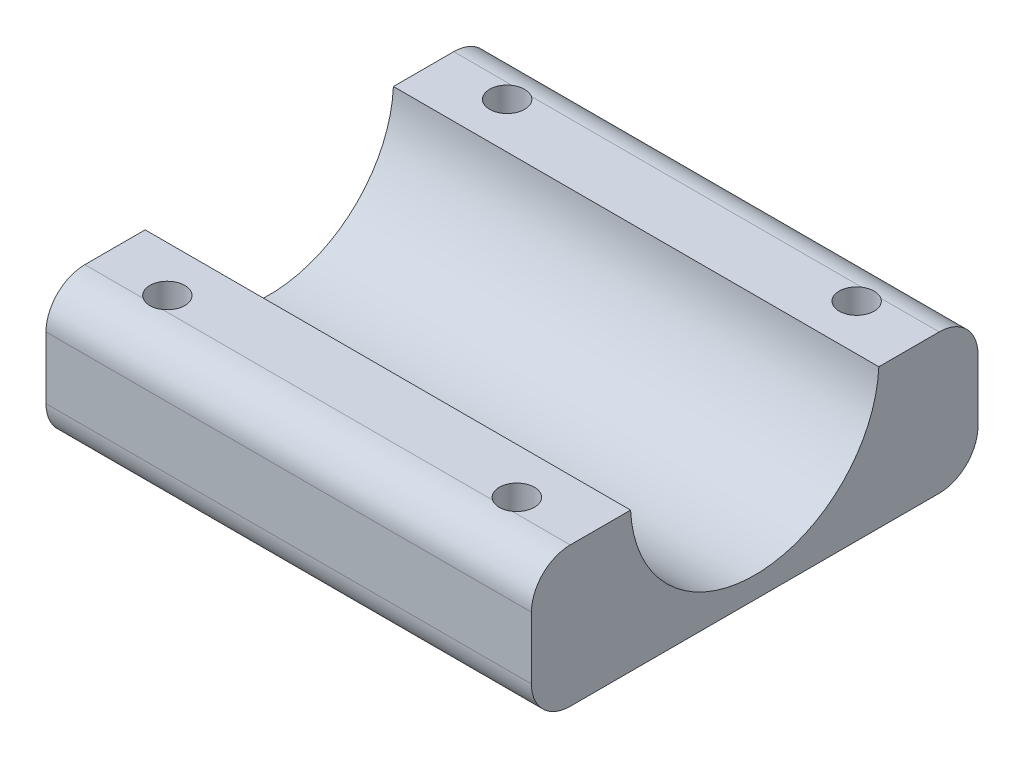
ISO-10303-21;
HEADER;
FILE_DESCRIPTION(('STEP AP214'),'2;1');
FILE_NAME('part.step','',(''),(''),'','','');
FILE_SCHEMA(('AUTOMOTIVE_DESIGN { 1 0 10303 214 1 1 1 1 }'));
ENDSEC;
DATA;
#1=APPLICATION_CONTEXT('core data for automotive mechanical design processes');
#2=APPLICATION_PROTOCOL_DEFINITION('international standard','automotive_design',2000,#1);
#3=PRODUCT_CONTEXT('',#1,'mechanical');
#4=PRODUCT('Part','Part','',(#3));
#5=PRODUCT_RELATED_PRODUCT_CATEGORY('part','',(#4));
#6=PRODUCT_DEFINITION_FORMATION('','',#4);
#7=PRODUCT_DEFINITION_CONTEXT('part definition',#1,'design');
#8=PRODUCT_DEFINITION('design','',#6,#7);
#9=PRODUCT_DEFINITION_SHAPE('','',#8);
#10=(LENGTH_UNIT() NAMED_UNIT(*) SI_UNIT(.MILLI.,.METRE.));
#11=(NAMED_UNIT(*) PLANE_ANGLE_UNIT() SI_UNIT($,.RADIAN.));
#12=(NAMED_UNIT(*) SI_UNIT($,.STERADIAN.) SOLID_ANGLE_UNIT());
#13=UNCERTAINTY_MEASURE_WITH_UNIT(LENGTH_MEASURE(1.E-05),#10,'distance_accuracy_value','');
#14=(GEOMETRIC_REPRESENTATION_CONTEXT(3) GLOBAL_UNCERTAINTY_ASSIGNED_CONTEXT((#13)) GLOBAL_UNIT_ASSIGNED_CONTEXT((#10,
#11,#12)) REPRESENTATION_CONTEXT('',''));
#15=CARTESIAN_POINT('',(0.,0.,0.));
#16=DIRECTION('',(0.,0.,1.));
#17=DIRECTION('',(1.,0.,0.));
#18=AXIS2_PLACEMENT_3D('',#15,#16,#17);
#19=CARTESIAN_POINT('',(25.,-11.,19.));
#20=DIRECTION('',(-1.,0.,0.));
#21=DIRECTION('',(0.,0.,1.));
#22=AXIS2_PLACEMENT_3D('',#19,#20,#21);
#23=CYLINDRICAL_SURFACE('',#22,4.);
#24=CARTESIAN_POINT('',(-15.1168593513323,-15.,19.));
#25=CARTESIAN_POINT('',(-15.1573493226515,-15.0000109242073,19.0778574955817));
#26=CARTESIAN_POINT('',(-15.200999771013,-14.9977274477931,19.1540259495156));
#27=CARTESIAN_POINT('',(-15.2941534411244,-14.9892434582838,19.3023684001236));
#28=CARTESIAN_POINT('',(-15.3436508801665,-14.9830467894245,19.3745462414952));
#29=CARTESIAN_POINT('',(-15.4478605502063,-14.9674431467714,19.5141099444437));
#30=CARTESIAN_POINT('',(-15.5025465894272,-14.9580517369091,19.5815171592083));
#31=CARTESIAN_POINT('',(-15.6169036932135,-14.9367588944703,19.7115277345354));
#32=CARTESIAN_POINT('',(-15.6765759342423,-14.924856868514,19.7741299546666));
#33=CARTESIAN_POINT('',(-15.862041479088,-14.8865410499203,19.9538040445996));
#34=CARTESIAN_POINT('',(-15.9947269476371,-14.8574402181653,20.063333735106));
#35=CARTESIAN_POINT('',(-16.2755732584803,-14.7977204142456,20.2601369098951));
#36=CARTESIAN_POINT('',(-16.423759698811,-14.7670989762058,20.3473727339024));
#37=CARTESIAN_POINT('',(-16.7445051105219,-14.7077377901675,20.5033912591476));
#38=CARTESIAN_POINT('',(-16.9180602444234,-14.6793171325302,20.5702714707651));
#39=CARTESIAN_POINT('',(-17.2752769746375,-14.6334988458983,20.67360310912));
#40=CARTESIAN_POINT('',(-17.458925459799,-14.6160872676328,20.7100930611152));
#41=CARTESIAN_POINT('',(-17.8198788257026,-14.5970438866187,20.7497826168194));
#42=CARTESIAN_POINT('',(-17.9969393040315,-14.5945604785481,20.7547796461988));
#43=CARTESIAN_POINT('',(-18.3491448521233,-14.603665315988,20.7360004114565));
#44=CARTESIAN_POINT('',(-18.5242899279135,-14.6152535172044,20.7122242379062));
#45=CARTESIAN_POINT('',(-18.8567868208954,-14.6488250161309,20.6393688950356));
#46=CARTESIAN_POINT('',(-19.0145726857033,-14.6701323340066,20.5919187162139));
#47=CARTESIAN_POINT('',(-19.3204469731311,-14.7189794615007,20.474190682313));
#48=CARTESIAN_POINT('',(-19.4685267128945,-14.7465247559277,20.4038927142524));
#49=CARTESIAN_POINT('',(-19.7650444420969,-14.8058026088642,20.2347450945025));
#50=CARTESIAN_POINT('',(-19.9123106589385,-14.8376887696085,20.13389244722));
#51=CARTESIAN_POINT('',(-20.1887309133918,-14.8970581196079,19.9090688065648));
#52=CARTESIAN_POINT('',(-20.3179137736349,-14.924548325662,19.7851353533026));
#53=CARTESIAN_POINT('',(-20.5232310806332,-14.9629034475965,19.5525613074241));
#54=CARTESIAN_POINT('',(-20.604313957578,-14.9762483146135,19.4486923027872));
#55=CARTESIAN_POINT('',(-20.7163084023614,-14.9901621549613,19.2856467872631));
#56=CARTESIAN_POINT('',(-20.7520715842306,-14.9937835167149,19.2300209908782));
#57=CARTESIAN_POINT('',(-20.8202018509445,-14.9987044935031,19.1165845685183));
#58=CARTESIAN_POINT('',(-20.8525668818273,-15.0000027118666,19.058772649559));
#59=CARTESIAN_POINT('',(-20.8831406486677,-15.,19.));
#60=B_SPLINE_CURVE_WITH_KNOTS('',3,(#24,#25,#26,#27,#28,#29,#30,#31,#32,#33,#34,#35,#36,#37,#38,
#39,#40,#41,#42,#43,#44,#45,#46,#47,#48,#49,#50,#51,#52,#53,#54,#55,#56,#57,#58,#59),
.UNSPECIFIED.,.F.,.F.,(4,2,2,2,2,2,2,2,2,2,2,2,2,2,2,2,2,4),(0.,0.263108350436759,
0.525958630143495,0.787546288254287,1.0491958415726,1.5702947033418,2.09226810629026,
2.65384856233941,3.21471602330402,3.74325888086913,4.27180007470835,4.76815579490835,
5.26494964749648,5.80654118475775,6.34725941618147,6.7433968577492,6.94193709517688,
7.140596654703),.UNSPECIFIED.);
#61=CARTESIAN_POINT('',(-15.1168593513323,-15.,19.));
#62=VERTEX_POINT('',#61);
#63=CARTESIAN_POINT('',(-20.8831406486677,-15.,19.));
#64=VERTEX_POINT('',#63);
#65=EDGE_CURVE('E62',#62,#64,#60,.T.);
#66=ORIENTED_EDGE('',*,*,#65,.F.);
#67=DIRECTION('',(-1.,0.,0.));
#68=VECTOR('',#67,1.);
#69=CARTESIAN_POINT('',(25.,-15.,19.));
#70=LINE('',#69,#68);
#71=CARTESIAN_POINT('',(15.1168593513323,-15.,19.));
#72=VERTEX_POINT('',#71);
#73=EDGE_CURVE('E197',#72,#62,#70,.T.);
#74=ORIENTED_EDGE('',*,*,#73,.F.);
#75=CARTESIAN_POINT('',(20.8831406486677,-15.,19.));
#76=CARTESIAN_POINT('',(20.8426506773485,-15.0000109242073,19.0778574955817));
#77=CARTESIAN_POINT('',(20.799000228987,-14.9977274477931,19.1540259495156));
#78=CARTESIAN_POINT('',(20.7058465588756,-14.9892434582838,19.3023684001236));
#79=CARTESIAN_POINT('',(20.6563491198335,-14.9830467894245,19.3745462414952));
#80=CARTESIAN_POINT('',(20.5521394497937,-14.9674431467714,19.5141099444437));
#81=CARTESIAN_POINT('',(20.4974534105728,-14.9580517369091,19.5815171592083));
#82=CARTESIAN_POINT('',(20.3830963067864,-14.9367588944703,19.7115277345354));
#83=CARTESIAN_POINT('',(20.3234240657577,-14.924856868514,19.7741299546666));
#84=CARTESIAN_POINT('',(20.137958520912,-14.8865410499203,19.9538040445996));
#85=CARTESIAN_POINT('',(20.0052730523629,-14.8574402181653,20.063333735106));
#86=CARTESIAN_POINT('',(19.7244267415197,-14.7977204142456,20.2601369098951));
#87=CARTESIAN_POINT('',(19.576240301189,-14.7670989762058,20.3473727339024));
#88=CARTESIAN_POINT('',(19.2554948894781,-14.7077377901675,20.5033912591476));
#89=CARTESIAN_POINT('',(19.0819397555766,-14.6793171325302,20.5702714707651));
#90=CARTESIAN_POINT('',(18.7247230253625,-14.6334988458983,20.67360310912));
#91=CARTESIAN_POINT('',(18.541074540201,-14.6160872676328,20.7100930611152));
#92=CARTESIAN_POINT('',(18.1801211742974,-14.5970438866187,20.7497826168194));
#93=CARTESIAN_POINT('',(18.0030606959685,-14.5945604785481,20.7547796461988));
#94=CARTESIAN_POINT('',(17.6508551478767,-14.603665315988,20.7360004114565));
#95=CARTESIAN_POINT('',(17.4757100720865,-14.6152535172044,20.7122242379062));
#96=CARTESIAN_POINT('',(17.1432131791046,-14.6488250161309,20.6393688950356));
#97=CARTESIAN_POINT('',(16.9854273142967,-14.6701323340066,20.5919187162139));
#98=CARTESIAN_POINT('',(16.6795530268689,-14.7189794615007,20.474190682313));
#99=CARTESIAN_POINT('',(16.5314732871055,-14.7465247559277,20.4038927142524));
#100=CARTESIAN_POINT('',(16.2349555579031,-14.8058026088642,20.2347450945025));
#101=CARTESIAN_POINT('',(16.0876893410615,-14.8376887696085,20.13389244722));
#102=CARTESIAN_POINT('',(15.8112690866082,-14.8970581196079,19.9090688065648));
#103=CARTESIAN_POINT('',(15.6820862263651,-14.924548325662,19.7851353533026));
#104=CARTESIAN_POINT('',(15.4767689193668,-14.9629034475965,19.5525613074241));
#105=CARTESIAN_POINT('',(15.395686042422,-14.9762483146135,19.4486923027872));
#106=CARTESIAN_POINT('',(15.2836915976386,-14.9901621549613,19.2856467872631));
#107=CARTESIAN_POINT('',(15.2479284157694,-14.9937835167149,19.2300209908782));
#108=CARTESIAN_POINT('',(15.1797981490555,-14.9987044935031,19.1165845685183));
#109=CARTESIAN_POINT('',(15.1474331181727,-15.0000027118666,19.058772649559));
#110=CARTESIAN_POINT('',(15.1168593513323,-15.,19.));
#111=B_SPLINE_CURVE_WITH_KNOTS('',3,(#75,#76,#77,#78,#79,#80,#81,#82,#83,#84,#85,#86,#87,#88,
#89,#90,#91,#92,#93,#94,#95,#96,#97,#98,#99,#100,#101,#102,#103,#104,#105,#106,#107,#108,#109,
#110),.UNSPECIFIED.,.F.,.F.,(4,2,2,2,2,2,2,2,2,2,2,2,2,2,2,2,2,4),(0.,0.263108350436761,
0.525958630143493,0.787546288254281,1.04919584157259,1.5702947033418,2.09226810629026,
2.6538485623394,3.21471602330401,3.74325888086913,4.27180007470835,4.76815579490835,
5.26494964749648,5.80654118475775,6.34725941618147,6.7433968577492,6.94193709517688,
7.140596654703),.UNSPECIFIED.);
#112=CARTESIAN_POINT('',(20.8831406486677,-15.,19.));
#113=VERTEX_POINT('',#112);
#114=EDGE_CURVE('E411',#113,#72,#111,.T.);
#115=ORIENTED_EDGE('',*,*,#114,.F.);
#116=CARTESIAN_POINT('',(25.,-15.,19.));
#117=VERTEX_POINT('',#116);
#118=EDGE_CURVE('E193',#117,#113,#70,.T.);
#119=ORIENTED_EDGE('',*,*,#118,.F.);
#120=CARTESIAN_POINT('',(25.,-11.,19.));
#121=DIRECTION('',(1.,0.,0.));
#122=DIRECTION('',(0.,0.,-1.));
#123=AXIS2_PLACEMENT_3D('',#120,#121,#122);
#124=CIRCLE('',#123,4.);
#125=CARTESIAN_POINT('',(25.,-11.,23.));
#126=VERTEX_POINT('',#125);
#127=EDGE_CURVE('E299',#126,#117,#124,.T.);
#128=ORIENTED_EDGE('',*,*,#127,.F.);
#129=DIRECTION('',(-1.,0.,0.));
#130=VECTOR('',#129,1.);
#131=CARTESIAN_POINT('',(25.,-11.,23.));
#132=LINE('',#131,#130);
#133=CARTESIAN_POINT('',(-25.,-11.,23.));
#134=VERTEX_POINT('',#133);
#135=EDGE_CURVE('E275',#126,#134,#132,.T.);
#136=ORIENTED_EDGE('',*,*,#135,.T.);
#137=CARTESIAN_POINT('',(-25.,-11.,19.));
#138=DIRECTION('',(1.,0.,0.));
#139=DIRECTION('',(0.,0.,-1.));
#140=AXIS2_PLACEMENT_3D('',#137,#138,#139);
#141=CIRCLE('',#140,4.);
#142=CARTESIAN_POINT('',(-25.,-15.,19.));
#143=VERTEX_POINT('',#142);
#144=EDGE_CURVE('E268',#134,#143,#141,.T.);
#145=ORIENTED_EDGE('',*,*,#144,.T.);
#146=EDGE_CURVE('E188',#64,#143,#70,.T.);
#147=ORIENTED_EDGE('',*,*,#146,.F.);
#148=EDGE_LOOP('',(#66,#74,#115,#119,#128,#136,#145,#147));
#149=FACE_BOUND('',#148,.T.);
#150=ADVANCED_FACE('F39',(#149),#23,.T.);
#151=CARTESIAN_POINT('',(25.,-11.,-19.));
#152=DIRECTION('',(-1.,0.,0.));
#153=DIRECTION('',(0.,0.,1.));
#154=AXIS2_PLACEMENT_3D('',#151,#152,#153);
#155=CYLINDRICAL_SURFACE('',#154,4.);
#156=CARTESIAN_POINT('',(15.1168593513323,-15.,-19.));
#157=CARTESIAN_POINT('',(15.1573493226515,-15.0000109242073,-19.0778574955817));
#158=CARTESIAN_POINT('',(15.200999771013,-14.9977274477931,-19.1540259495156));
#159=CARTESIAN_POINT('',(15.2941534411244,-14.9892434582838,-19.3023684001236));
#160=CARTESIAN_POINT('',(15.3436508801665,-14.9830467894245,-19.3745462414952));
#161=CARTESIAN_POINT('',(15.4478605502063,-14.9674431467714,-19.5141099444437));
#162=CARTESIAN_POINT('',(15.5025465894272,-14.9580517369091,-19.5815171592083));
#163=CARTESIAN_POINT('',(15.6169036932135,-14.9367588944703,-19.7115277345354));
#164=CARTESIAN_POINT('',(15.6765759342423,-14.924856868514,-19.7741299546666));
#165=CARTESIAN_POINT('',(15.862041479088,-14.8865410499203,-19.9538040445996));
#166=CARTESIAN_POINT('',(15.9947269476371,-14.8574402181653,-20.063333735106));
#167=CARTESIAN_POINT('',(16.2755732584803,-14.7977204142456,-20.2601369098951));
#168=CARTESIAN_POINT('',(16.423759698811,-14.7670989762058,-20.3473727339024));
#169=CARTESIAN_POINT('',(16.7445051105219,-14.7077377901675,-20.5033912591476));
#170=CARTESIAN_POINT('',(16.9180602444234,-14.6793171325302,-20.5702714707651));
#171=CARTESIAN_POINT('',(17.2752769746375,-14.6334988458983,-20.67360310912));
#172=CARTESIAN_POINT('',(17.458925459799,-14.6160872676328,-20.7100930611152));
#173=CARTESIAN_POINT('',(17.8198788257026,-14.5970438866187,-20.7497826168194));
#174=CARTESIAN_POINT('',(17.9969393040315,-14.5945604785481,-20.7547796461988));
#175=CARTESIAN_POINT('',(18.3491448521233,-14.603665315988,-20.7360004114565));
#176=CARTESIAN_POINT('',(18.5242899279135,-14.6152535172044,-20.7122242379062));
#177=CARTESIAN_POINT('',(18.8567868208954,-14.6488250161309,-20.6393688950356));
#178=CARTESIAN_POINT('',(19.0145726857033,-14.6701323340066,-20.5919187162139));
#179=CARTESIAN_POINT('',(19.3204469731311,-14.7189794615007,-20.474190682313));
#180=CARTESIAN_POINT('',(19.4685267128945,-14.7465247559277,-20.4038927142524));
#181=CARTESIAN_POINT('',(19.7650444420969,-14.8058026088642,-20.2347450945025));
#182=CARTESIAN_POINT('',(19.9123106589385,-14.8376887696085,-20.13389244722));
#183=CARTESIAN_POINT('',(20.1887309133918,-14.8970581196079,-19.9090688065648));
#184=CARTESIAN_POINT('',(20.3179137736349,-14.924548325662,-19.7851353533026));
#185=CARTESIAN_POINT('',(20.5232310806332,-14.9629034475965,-19.5525613074241));
#186=CARTESIAN_POINT('',(20.604313957578,-14.9762483146135,-19.4486923027872));
#187=CARTESIAN_POINT('',(20.7163084023614,-14.9901621549613,-19.2856467872631));
#188=CARTESIAN_POINT('',(20.7520715842306,-14.9937835167149,-19.2300209908782));
#189=CARTESIAN_POINT('',(20.8202018509445,-14.9987044935031,-19.1165845685182));
#190=CARTESIAN_POINT('',(20.8525668818273,-15.0000027118666,-19.058772649559));
#191=CARTESIAN_POINT('',(20.8831406486677,-15.,-19.));
#192=B_SPLINE_CURVE_WITH_KNOTS('',3,(#156,#157,#158,#159,#160,#161,#162,#163,#164,#165,#166,
#167,#168,#169,#170,#171,#172,#173,#174,#175,#176,#177,#178,#179,#180,#181,#182,#183,#184,#185,
#186,#187,#188,#189,#190,#191),.UNSPECIFIED.,.F.,.F.,(4,2,2,2,2,2,2,2,2,2,2,2,2,2,2,2,2,4),(0.,
0.263108350436761,0.525958630143493,0.787546288254285,1.04919584157259,1.5702947033418,
2.09226810629026,2.6538485623394,3.21471602330401,3.74325888086913,4.27180007470835,
4.76815579490835,5.26494964749648,5.80654118475775,6.34725941618147,6.7433968577492,
6.94193709517689,7.140596654703),.UNSPECIFIED.);
#193=CARTESIAN_POINT('',(15.1168593513323,-15.,-19.));
#194=VERTEX_POINT('',#193);
#195=CARTESIAN_POINT('',(20.8831406486677,-15.,-19.));
#196=VERTEX_POINT('',#195);
#197=EDGE_CURVE('E167',#194,#196,#192,.T.);
#198=ORIENTED_EDGE('',*,*,#197,.F.);
#199=DIRECTION('',(-1.,0.,0.));
#200=VECTOR('',#199,1.);
#201=CARTESIAN_POINT('',(25.,-15.,-19.));
#202=LINE('',#201,#200);
#203=CARTESIAN_POINT('',(-15.1168593513323,-15.,-19.));
#204=VERTEX_POINT('',#203);
#205=EDGE_CURVE('E178',#194,#204,#202,.T.);
#206=ORIENTED_EDGE('',*,*,#205,.T.);
#207=CARTESIAN_POINT('',(-20.8831406486677,-15.,-19.));
#208=CARTESIAN_POINT('',(-20.8426506773485,-15.0000109242073,-19.0778574955817));
#209=CARTESIAN_POINT('',(-20.799000228987,-14.9977274477931,-19.1540259495156));
#210=CARTESIAN_POINT('',(-20.7058465588756,-14.9892434582838,-19.3023684001236));
#211=CARTESIAN_POINT('',(-20.6563491198335,-14.9830467894245,-19.3745462414952));
#212=CARTESIAN_POINT('',(-20.5521394497937,-14.9674431467714,-19.5141099444437));
#213=CARTESIAN_POINT('',(-20.4974534105728,-14.9580517369091,-19.5815171592083));
#214=CARTESIAN_POINT('',(-20.3830963067864,-14.9367588944703,-19.7115277345354));
#215=CARTESIAN_POINT('',(-20.3234240657577,-14.924856868514,-19.7741299546666));
#216=CARTESIAN_POINT('',(-20.137958520912,-14.8865410499203,-19.9538040445996));
#217=CARTESIAN_POINT('',(-20.0052730523629,-14.8574402181653,-20.063333735106));
#218=CARTESIAN_POINT('',(-19.7244267415197,-14.7977204142456,-20.2601369098951));
#219=CARTESIAN_POINT('',(-19.576240301189,-14.7670989762058,-20.3473727339024));
#220=CARTESIAN_POINT('',(-19.2554948894781,-14.7077377901675,-20.5033912591476));
#221=CARTESIAN_POINT('',(-19.0819397555766,-14.6793171325302,-20.5702714707651));
#222=CARTESIAN_POINT('',(-18.7247230253625,-14.6334988458983,-20.67360310912));
#223=CARTESIAN_POINT('',(-18.5410745402009,-14.6160872676328,-20.7100930611152));
#224=CARTESIAN_POINT('',(-18.1801211742974,-14.5970438866187,-20.7497826168194));
#225=CARTESIAN_POINT('',(-18.0030606959685,-14.5945604785481,-20.7547796461988));
#226=CARTESIAN_POINT('',(-17.6508551478767,-14.603665315988,-20.7360004114565));
#227=CARTESIAN_POINT('',(-17.4757100720865,-14.6152535172044,-20.7122242379062));
#228=CARTESIAN_POINT('',(-17.1432131791046,-14.6488250161309,-20.6393688950356));
#229=CARTESIAN_POINT('',(-16.9854273142967,-14.6701323340066,-20.5919187162139));
#230=CARTESIAN_POINT('',(-16.6795530268689,-14.7189794615007,-20.474190682313));
#231=CARTESIAN_POINT('',(-16.5314732871055,-14.7465247559277,-20.4038927142524));
#232=CARTESIAN_POINT('',(-16.2349555579031,-14.8058026088642,-20.2347450945025));
#233=CARTESIAN_POINT('',(-16.0876893410615,-14.8376887696085,-20.13389244722));
#234=CARTESIAN_POINT('',(-15.8112690866082,-14.8970581196079,-19.9090688065648));
#235=CARTESIAN_POINT('',(-15.6820862263651,-14.924548325662,-19.7851353533026));
#236=CARTESIAN_POINT('',(-15.4767689193668,-14.9629034475965,-19.5525613074241));
#237=CARTESIAN_POINT('',(-15.395686042422,-14.9762483146135,-19.4486923027872));
#238=CARTESIAN_POINT('',(-15.2836915976386,-14.9901621549613,-19.2856467872631));
#239=CARTESIAN_POINT('',(-15.2479284157694,-14.9937835167149,-19.2300209908782));
#240=CARTESIAN_POINT('',(-15.1797981490555,-14.9987044935031,-19.1165845685182));
#241=CARTESIAN_POINT('',(-15.1474331181727,-15.0000027118666,-19.058772649559));
#242=CARTESIAN_POINT('',(-15.1168593513323,-15.,-19.));
#243=B_SPLINE_CURVE_WITH_KNOTS('',3,(#207,#208,#209,#210,#211,#212,#213,#214,#215,#216,#217,
#218,#219,#220,#221,#222,#223,#224,#225,#226,#227,#228,#229,#230,#231,#232,#233,#234,#235,#236,
#237,#238,#239,#240,#241,#242),.UNSPECIFIED.,.F.,.F.,(4,2,2,2,2,2,2,2,2,2,2,2,2,2,2,2,2,4),(0.,
0.263108350436764,0.525958630143499,0.787546288254292,1.0491958415726,1.57029470334181,
2.09226810629026,2.65384856233941,3.21471602330402,3.74325888086913,4.27180007470835,
4.76815579490836,5.26494964749648,5.80654118475775,6.34725941618147,6.7433968577492,
6.94193709517688,7.140596654703),.UNSPECIFIED.);
#244=CARTESIAN_POINT('',(-20.8831406486677,-15.,-19.));
#245=VERTEX_POINT('',#244);
#246=EDGE_CURVE('E55',#245,#204,#243,.T.);
#247=ORIENTED_EDGE('',*,*,#246,.F.);
#248=CARTESIAN_POINT('',(-25.,-15.,-19.));
#249=VERTEX_POINT('',#248);
#250=EDGE_CURVE('E186',#245,#249,#202,.T.);
#251=ORIENTED_EDGE('',*,*,#250,.T.);
#252=CARTESIAN_POINT('',(-25.,-11.,-19.));
#253=DIRECTION('',(1.,0.,0.));
#254=DIRECTION('',(0.,0.,-1.));
#255=AXIS2_PLACEMENT_3D('',#252,#253,#254);
#256=CIRCLE('',#255,4.);
#257=CARTESIAN_POINT('',(-25.,-11.,-23.));
#258=VERTEX_POINT('',#257);
#259=EDGE_CURVE('E270',#249,#258,#256,.T.);
#260=ORIENTED_EDGE('',*,*,#259,.T.);
#261=DIRECTION('',(-1.,0.,0.));
#262=VECTOR('',#261,1.);
#263=CARTESIAN_POINT('',(25.,-11.,-23.));
#264=LINE('',#263,#262);
#265=CARTESIAN_POINT('',(25.,-11.,-23.));
#266=VERTEX_POINT('',#265);
#267=EDGE_CURVE('E189',#266,#258,#264,.T.);
#268=ORIENTED_EDGE('',*,*,#267,.F.);
#269=CARTESIAN_POINT('',(25.,-11.,-19.));
#270=DIRECTION('',(1.,0.,0.));
#271=DIRECTION('',(0.,0.,-1.));
#272=AXIS2_PLACEMENT_3D('',#269,#270,#271);
#273=CIRCLE('',#272,4.);
#274=CARTESIAN_POINT('',(25.,-15.,-19.));
#275=VERTEX_POINT('',#274);
#276=EDGE_CURVE('E349',#275,#266,#273,.T.);
#277=ORIENTED_EDGE('',*,*,#276,.F.);
#278=EDGE_CURVE('E180',#275,#196,#202,.T.);
#279=ORIENTED_EDGE('',*,*,#278,.T.);
#280=EDGE_LOOP('',(#198,#206,#247,#251,#260,#268,#277,#279));
#281=FACE_BOUND('',#280,.T.);
#282=ADVANCED_FACE('F177',(#281),#155,.T.);
#283=CARTESIAN_POINT('',(25.,-4.6,-19.));
#284=DIRECTION('',(-1.,0.,0.));
#285=DIRECTION('',(0.,0.,1.));
#286=AXIS2_PLACEMENT_3D('',#283,#284,#285);
#287=CYLINDRICAL_SURFACE('',#286,4.);
#288=CARTESIAN_POINT('',(18.9949874371066,-0.6,-19.));
#289=CARTESIAN_POINT('',(18.9528080505859,-0.600002290201008,-19.0279782687762));
#290=CARTESIAN_POINT('',(18.9094699375662,-0.600293109258532,-19.054162436945));
#291=CARTESIAN_POINT('',(18.8207506643026,-0.601246630542694,-19.1027880961604));
#292=CARTESIAN_POINT('',(18.775369663094,-0.601909303866988,-19.1252298779078));
#293=CARTESIAN_POINT('',(18.6367080465194,-0.60414515604213,-19.1866521635867));
#294=CARTESIAN_POINT('',(18.5407755741953,-0.605967454515857,-19.2198177956695));
#295=CARTESIAN_POINT('',(18.3447108790185,-0.609016111648687,-19.2695824039112));
#296=CARTESIAN_POINT('',(18.2445771529861,-0.610242254997947,-19.2861753969049));
#297=CARTESIAN_POINT('',(18.0429252939834,-0.611432977587128,-19.3023260095373));
#298=CARTESIAN_POINT('',(17.9414072407699,-0.611397629202323,-19.3018846064864));
#299=CARTESIAN_POINT('',(17.7400149572337,-0.610084395953699,-19.2839916011113));
#300=CARTESIAN_POINT('',(17.6401391343925,-0.608807797075411,-19.266557603754));
#301=CARTESIAN_POINT('',(17.444762981889,-0.605710678825216,-19.2151942389305));
#302=CARTESIAN_POINT('',(17.3492591599958,-0.603890602630139,-19.1812782975269));
#303=CARTESIAN_POINT('',(17.2134628948282,-0.601745422922836,-19.1197807652606));
#304=CARTESIAN_POINT('',(17.1703945654969,-0.601136078493984,-19.0981480345368));
#305=CARTESIAN_POINT('',(17.0862091669758,-0.600264553601652,-19.0515455180329));
#306=CARTESIAN_POINT('',(17.0450884560688,-0.600001698383489,-19.0265823227808));
#307=CARTESIAN_POINT('',(17.0050125628934,-0.6,-19.));
#308=B_SPLINE_CURVE_WITH_KNOTS('',3,(#288,#289,#290,#291,#292,#293,#294,#295,#296,#297,#298,
#299,#300,#301,#302,#303,#304,#305,#306,#307),.UNSPECIFIED.,.F.,.F.,(4,2,2,2,2,2,2,2,2,4),(0.,
0.151748564164445,0.303485335317345,0.606485618853395,0.909595254081975,1.21268749909945,
1.51546606256915,1.81799839737315,1.96246492195647,2.10664969408635),.UNSPECIFIED.);
#309=CARTESIAN_POINT('',(18.9949874371066,-0.6,-19.));
#310=VERTEX_POINT('',#309);
#311=CARTESIAN_POINT('',(17.0050125628934,-0.6,-19.));
#312=VERTEX_POINT('',#311);
#313=EDGE_CURVE('E11',#310,#312,#308,.T.);
#314=ORIENTED_EDGE('',*,*,#313,.F.);
#315=DIRECTION('',(-1.,0.,0.));
#316=VECTOR('',#315,1.);
#317=CARTESIAN_POINT('',(25.,-0.6,-19.));
#318=LINE('',#317,#316);
#319=CARTESIAN_POINT('',(25.,-0.6,-19.));
#320=VERTEX_POINT('',#319);
#321=EDGE_CURVE('E310',#320,#310,#318,.T.);
#322=ORIENTED_EDGE('',*,*,#321,.F.);
#323=CARTESIAN_POINT('',(25.,-4.6,-19.));
#324=DIRECTION('',(1.,0.,0.));
#325=DIRECTION('',(0.,0.,-1.));
#326=AXIS2_PLACEMENT_3D('',#323,#324,#325);
#327=CIRCLE('',#326,4.);
#328=CARTESIAN_POINT('',(25.,-4.6,-23.));
#329=VERTEX_POINT('',#328);
#330=EDGE_CURVE('E345',#329,#320,#327,.T.);
#331=ORIENTED_EDGE('',*,*,#330,.F.);
#332=DIRECTION('',(-1.,0.,0.));
#333=VECTOR('',#332,1.);
#334=CARTESIAN_POINT('',(25.,-4.6,-23.));
#335=LINE('',#334,#333);
#336=CARTESIAN_POINT('',(-25.,-4.6,-23.));
#337=VERTEX_POINT('',#336);
#338=EDGE_CURVE('E312',#329,#337,#335,.T.);
#339=ORIENTED_EDGE('',*,*,#338,.T.);
#340=CARTESIAN_POINT('',(-25.,-4.6,-19.));
#341=DIRECTION('',(1.,0.,0.));
#342=DIRECTION('',(0.,0.,-1.));
#343=AXIS2_PLACEMENT_3D('',#340,#341,#342);
#344=CIRCLE('',#343,4.);
#345=CARTESIAN_POINT('',(-25.,-0.6,-19.));
#346=VERTEX_POINT('',#345);
#347=EDGE_CURVE('E288',#337,#346,#344,.T.);
#348=ORIENTED_EDGE('',*,*,#347,.T.);
#349=CARTESIAN_POINT('',(-18.9949874371066,-0.6,-19.));
#350=VERTEX_POINT('',#349);
#351=EDGE_CURVE('E308',#350,#346,#318,.T.);
#352=ORIENTED_EDGE('',*,*,#351,.F.);
#353=CARTESIAN_POINT('',(-17.0050125628934,-0.6,-19.));
#354=CARTESIAN_POINT('',(-17.0471919494141,-0.600002290201007,-19.0279782687762));
#355=CARTESIAN_POINT('',(-17.0905300624338,-0.600293109258532,-19.054162436945));
#356=CARTESIAN_POINT('',(-17.1792493356974,-0.601246630542694,-19.1027880961604));
#357=CARTESIAN_POINT('',(-17.224630336906,-0.601909303866987,-19.1252298779078));
#358=CARTESIAN_POINT('',(-17.3632919534806,-0.60414515604213,-19.1866521635867));
#359=CARTESIAN_POINT('',(-17.4592244258047,-0.605967454515857,-19.2198177956695));
#360=CARTESIAN_POINT('',(-17.6552891209815,-0.609016111648688,-19.2695824039112));
#361=CARTESIAN_POINT('',(-17.7554228470139,-0.610242254997947,-19.2861753969049));
#362=CARTESIAN_POINT('',(-17.9570747060166,-0.611432977587128,-19.3023260095373));
#363=CARTESIAN_POINT('',(-18.0585927592301,-0.611397629202323,-19.3018846064864));
#364=CARTESIAN_POINT('',(-18.2599850427663,-0.610084395953699,-19.2839916011113));
#365=CARTESIAN_POINT('',(-18.3598608656075,-0.608807797075411,-19.266557603754));
#366=CARTESIAN_POINT('',(-18.555237018111,-0.605710678825216,-19.2151942389305));
#367=CARTESIAN_POINT('',(-18.6507408400042,-0.603890602630139,-19.181278297527));
#368=CARTESIAN_POINT('',(-18.7865371051718,-0.601745422922836,-19.1197807652606));
#369=CARTESIAN_POINT('',(-18.8296054345031,-0.601136078493984,-19.0981480345368));
#370=CARTESIAN_POINT('',(-18.9137908330242,-0.600264553601652,-19.0515455180329));
#371=CARTESIAN_POINT('',(-18.9549115439312,-0.600001698383489,-19.0265823227808));
#372=CARTESIAN_POINT('',(-18.9949874371066,-0.6,-19.));
#373=B_SPLINE_CURVE_WITH_KNOTS('',3,(#353,#354,#355,#356,#357,#358,#359,#360,#361,#362,#363,
#364,#365,#366,#367,#368,#369,#370,#371,#372),.UNSPECIFIED.,.F.,.F.,(4,2,2,2,2,2,2,2,2,4),(0.,
0.151748564164441,0.303485335317343,0.606485618853394,0.909595254081971,1.21268749909945,
1.51546606256916,1.81799839737315,1.96246492195647,2.10664969408635),.UNSPECIFIED.);
#374=CARTESIAN_POINT('',(-17.0050125628934,-0.6,-19.));
#375=VERTEX_POINT('',#374);
#376=EDGE_CURVE('E48',#375,#350,#373,.T.);
#377=ORIENTED_EDGE('',*,*,#376,.F.);
#378=EDGE_CURVE('E313',#312,#375,#318,.T.);
#379=ORIENTED_EDGE('',*,*,#378,.F.);
#380=EDGE_LOOP('',(#314,#322,#331,#339,#348,#352,#377,#379));
#381=FACE_BOUND('',#380,.T.);
#382=ADVANCED_FACE('F251',(#381),#287,.T.);
#383=CARTESIAN_POINT('',(25.,-4.6,19.));
#384=DIRECTION('',(-1.,0.,0.));
#385=DIRECTION('',(0.,0.,1.));
#386=AXIS2_PLACEMENT_3D('',#383,#384,#385);
#387=CYLINDRICAL_SURFACE('',#386,4.);
#388=CARTESIAN_POINT('',(-18.9949874371066,-0.6,19.));
#389=CARTESIAN_POINT('',(-18.9528080505859,-0.600002290201007,19.0279782687762));
#390=CARTESIAN_POINT('',(-18.9094699375662,-0.600293109258532,19.054162436945));
#391=CARTESIAN_POINT('',(-18.8207506643026,-0.601246630542693,19.1027880961604));
#392=CARTESIAN_POINT('',(-18.775369663094,-0.601909303866988,19.1252298779078));
#393=CARTESIAN_POINT('',(-18.6367080465194,-0.60414515604213,19.1866521635867));
#394=CARTESIAN_POINT('',(-18.5407755741953,-0.605967454515857,19.2198177956695));
#395=CARTESIAN_POINT('',(-18.3447108790185,-0.609016111648687,19.2695824039112));
#396=CARTESIAN_POINT('',(-18.2445771529861,-0.610242254997947,19.2861753969049));
#397=CARTESIAN_POINT('',(-18.0429252939834,-0.611432977587128,19.3023260095373));
#398=CARTESIAN_POINT('',(-17.9414072407699,-0.611397629202323,19.3018846064864));
#399=CARTESIAN_POINT('',(-17.7400149572337,-0.610084395953699,19.2839916011113));
#400=CARTESIAN_POINT('',(-17.6401391343925,-0.608807797075411,19.266557603754));
#401=CARTESIAN_POINT('',(-17.444762981889,-0.605710678825215,19.2151942389305));
#402=CARTESIAN_POINT('',(-17.3492591599958,-0.603890602630139,19.181278297527));
#403=CARTESIAN_POINT('',(-17.2134628948282,-0.601745422922836,19.1197807652606));
#404=CARTESIAN_POINT('',(-17.1703945654969,-0.601136078493984,19.0981480345368));
#405=CARTESIAN_POINT('',(-17.0862091669758,-0.600264553601652,19.0515455180329));
#406=CARTESIAN_POINT('',(-17.0450884560688,-0.600001698383489,19.0265823227808));
#407=CARTESIAN_POINT('',(-17.0050125628934,-0.6,19.));
#408=B_SPLINE_CURVE_WITH_KNOTS('',3,(#388,#389,#390,#391,#392,#393,#394,#395,#396,#397,#398,
#399,#400,#401,#402,#403,#404,#405,#406,#407),.UNSPECIFIED.,.F.,.F.,(4,2,2,2,2,2,2,2,2,4),(0.,
0.151748564164443,0.303485335317337,0.606485618853388,0.909595254081965,1.21268749909944,
1.51546606256914,1.81799839737314,1.96246492195646,2.10664969408635),.UNSPECIFIED.);
#409=CARTESIAN_POINT('',(-18.9949874371066,-0.6,19.));
#410=VERTEX_POINT('',#409);
#411=CARTESIAN_POINT('',(-17.0050125628934,-0.6,19.));
#412=VERTEX_POINT('',#411);
#413=EDGE_CURVE('E205',#410,#412,#408,.T.);
#414=ORIENTED_EDGE('',*,*,#413,.F.);
#415=DIRECTION('',(-1.,0.,0.));
#416=VECTOR('',#415,1.);
#417=CARTESIAN_POINT('',(25.,-0.6,19.));
#418=LINE('',#417,#416);
#419=CARTESIAN_POINT('',(-25.,-0.6,19.));
#420=VERTEX_POINT('',#419);
#421=EDGE_CURVE('E304',#410,#420,#418,.T.);
#422=ORIENTED_EDGE('',*,*,#421,.T.);
#423=CARTESIAN_POINT('',(-25.,-4.6,19.));
#424=DIRECTION('',(1.,0.,0.));
#425=DIRECTION('',(0.,0.,-1.));
#426=AXIS2_PLACEMENT_3D('',#423,#424,#425);
#427=CIRCLE('',#426,4.);
#428=CARTESIAN_POINT('',(-25.,-4.6,23.));
#429=VERTEX_POINT('',#428);
#430=EDGE_CURVE('E295',#420,#429,#427,.T.);
#431=ORIENTED_EDGE('',*,*,#430,.T.);
#432=DIRECTION('',(-1.,0.,0.));
#433=VECTOR('',#432,1.);
#434=CARTESIAN_POINT('',(25.,-4.6,23.));
#435=LINE('',#434,#433);
#436=CARTESIAN_POINT('',(25.,-4.6,23.));
#437=VERTEX_POINT('',#436);
#438=EDGE_CURVE('E301',#437,#429,#435,.T.);
#439=ORIENTED_EDGE('',*,*,#438,.F.);
#440=CARTESIAN_POINT('',(25.,-4.6,19.));
#441=DIRECTION('',(1.,0.,0.));
#442=DIRECTION('',(0.,0.,-1.));
#443=AXIS2_PLACEMENT_3D('',#440,#441,#442);
#444=CIRCLE('',#443,4.);
#445=CARTESIAN_POINT('',(25.,-0.6,19.));
#446=VERTEX_POINT('',#445);
#447=EDGE_CURVE('E342',#446,#437,#444,.T.);
#448=ORIENTED_EDGE('',*,*,#447,.F.);
#449=CARTESIAN_POINT('',(18.9949874371066,-0.6,19.));
#450=VERTEX_POINT('',#449);
#451=EDGE_CURVE('E305',#446,#450,#418,.T.);
#452=ORIENTED_EDGE('',*,*,#451,.T.);
#453=CARTESIAN_POINT('',(17.0050125628934,-0.6,19.));
#454=CARTESIAN_POINT('',(17.0471919494141,-0.600002290201008,19.0279782687762));
#455=CARTESIAN_POINT('',(17.0905300624338,-0.600293109258532,19.054162436945));
#456=CARTESIAN_POINT('',(17.1792493356974,-0.601246630542694,19.1027880961604));
#457=CARTESIAN_POINT('',(17.224630336906,-0.601909303866988,19.1252298779078));
#458=CARTESIAN_POINT('',(17.3632919534806,-0.60414515604213,19.1866521635867));
#459=CARTESIAN_POINT('',(17.4592244258047,-0.605967454515857,19.2198177956695));
#460=CARTESIAN_POINT('',(17.6552891209815,-0.609016111648687,19.2695824039112));
#461=CARTESIAN_POINT('',(17.7554228470139,-0.610242254997947,19.2861753969049));
#462=CARTESIAN_POINT('',(17.9570747060166,-0.611432977587128,19.3023260095373));
#463=CARTESIAN_POINT('',(18.0585927592301,-0.611397629202323,19.3018846064864));
#464=CARTESIAN_POINT('',(18.2599850427663,-0.6100843959537,19.2839916011113));
#465=CARTESIAN_POINT('',(18.3598608656075,-0.608807797075412,19.266557603754));
#466=CARTESIAN_POINT('',(18.555237018111,-0.605710678825216,19.2151942389305));
#467=CARTESIAN_POINT('',(18.6507408400042,-0.603890602630139,19.1812782975269));
#468=CARTESIAN_POINT('',(18.7865371051718,-0.601745422922836,19.1197807652606));
#469=CARTESIAN_POINT('',(18.8296054345031,-0.601136078493984,19.0981480345368));
#470=CARTESIAN_POINT('',(18.9137908330242,-0.600264553601652,19.0515455180329));
#471=CARTESIAN_POINT('',(18.9549115439312,-0.600001698383489,19.0265823227808));
#472=CARTESIAN_POINT('',(18.9949874371066,-0.6,19.));
#473=B_SPLINE_CURVE_WITH_KNOTS('',3,(#453,#454,#455,#456,#457,#458,#459,#460,#461,#462,#463,
#464,#465,#466,#467,#468,#469,#470,#471,#472),.UNSPECIFIED.,.F.,.F.,(4,2,2,2,2,2,2,2,2,4),(0.,
0.151748564164445,0.303485335317345,0.606485618853395,0.909595254081975,1.21268749909945,
1.51546606256916,1.81799839737315,1.96246492195647,2.10664969408635),.UNSPECIFIED.);
#474=CARTESIAN_POINT('',(17.0050125628934,-0.6,19.));
#475=VERTEX_POINT('',#474);
#476=EDGE_CURVE('E196',#475,#450,#473,.T.);
#477=ORIENTED_EDGE('',*,*,#476,.F.);
#478=EDGE_CURVE('E309',#475,#412,#418,.T.);
#479=ORIENTED_EDGE('',*,*,#478,.T.);
#480=EDGE_LOOP('',(#414,#422,#431,#439,#448,#452,#477,#479));
#481=FACE_BOUND('',#480,.T.);
#482=ADVANCED_FACE('F212',(#481),#387,.T.);
#483=CARTESIAN_POINT('',(25.,-0.6,-19.));
#484=DIRECTION('',(0.,-1.,0.));
#485=DIRECTION('',(0.,0.,-1.));
#486=AXIS2_PLACEMENT_3D('',#483,#484,#485);
#487=PLANE('',#486);
#488=CARTESIAN_POINT('',(18.,-0.6,-17.5));
#489=DIRECTION('',(0.,-1.,0.));
#490=DIRECTION('',(0.,0.,-1.));
#491=AXIS2_PLACEMENT_3D('',#488,#489,#490);
#492=CIRCLE('',#491,1.8);
#493=EDGE_CURVE('E335',#312,#310,#492,.F.);
#494=ORIENTED_EDGE('',*,*,#493,.F.);
#495=ORIENTED_EDGE('',*,*,#378,.T.);
#496=CARTESIAN_POINT('',(-18.,-0.6,-17.5));
#497=DIRECTION('',(0.,-1.,0.));
#498=DIRECTION('',(0.,0.,-1.));
#499=AXIS2_PLACEMENT_3D('',#496,#497,#498);
#500=CIRCLE('',#499,1.8);
#501=EDGE_CURVE('E334',#350,#375,#500,.F.);
#502=ORIENTED_EDGE('',*,*,#501,.F.);
#503=ORIENTED_EDGE('',*,*,#351,.T.);
#504=DIRECTION('',(0.,0.,1.));
#505=VECTOR('',#504,1.);
#506=CARTESIAN_POINT('',(-25.,-0.6,-19.));
#507=LINE('',#506,#505);
#508=CARTESIAN_POINT('',(-25.,-0.6,-12.7859297667397));
#509=VERTEX_POINT('',#508);
#510=EDGE_CURVE('E292',#346,#509,#507,.T.);
#511=ORIENTED_EDGE('',*,*,#510,.T.);
#512=DIRECTION('',(1.,0.,0.));
#513=VECTOR('',#512,1.);
#514=CARTESIAN_POINT('',(-25.,-0.6,-12.7859297667397));
#515=LINE('',#514,#513);
#516=CARTESIAN_POINT('',(25.,-0.6,-12.7859297667397));
#517=VERTEX_POINT('',#516);
#518=EDGE_CURVE('E276',#509,#517,#515,.T.);
#519=ORIENTED_EDGE('',*,*,#518,.T.);
#520=DIRECTION('',(0.,0.,1.));
#521=VECTOR('',#520,1.);
#522=CARTESIAN_POINT('',(25.,-0.6,-19.));
#523=LINE('',#522,#521);
#524=EDGE_CURVE('E340',#320,#517,#523,.T.);
#525=ORIENTED_EDGE('',*,*,#524,.F.);
#526=ORIENTED_EDGE('',*,*,#321,.T.);
#527=EDGE_LOOP('',(#494,#495,#502,#503,#511,#519,#525,#526));
#528=FACE_BOUND('',#527,.T.);
#529=ADVANCED_FACE('F245',(#528),#487,.F.);
#530=CARTESIAN_POINT('',(25.,-15.,19.));
#531=DIRECTION('',(0.,1.,0.));
#532=DIRECTION('',(0.,0.,1.));
#533=AXIS2_PLACEMENT_3D('',#530,#531,#532);
#534=PLANE('',#533);
#535=CARTESIAN_POINT('',(18.,-15.,-17.5));
#536=DIRECTION('',(0.,1.,0.));
#537=DIRECTION('',(0.,0.,1.));
#538=AXIS2_PLACEMENT_3D('',#535,#536,#537);
#539=CIRCLE('',#538,3.25);
#540=EDGE_CURVE('E164',#194,#196,#539,.T.);
#541=ORIENTED_EDGE('',*,*,#540,.T.);
#542=ORIENTED_EDGE('',*,*,#278,.F.);
#543=DIRECTION('',(0.,0.,-1.));
#544=VECTOR('',#543,1.);
#545=CARTESIAN_POINT('',(25.,-15.,19.));
#546=LINE('',#545,#544);
#547=EDGE_CURVE('E351',#117,#275,#546,.T.);
#548=ORIENTED_EDGE('',*,*,#547,.F.);
#549=ORIENTED_EDGE('',*,*,#118,.T.);
#550=CARTESIAN_POINT('',(18.,-15.,17.5));
#551=DIRECTION('',(0.,1.,0.));
#552=DIRECTION('',(0.,0.,1.));
#553=AXIS2_PLACEMENT_3D('',#550,#551,#552);
#554=CIRCLE('',#553,3.25);
#555=EDGE_CURVE('E172',#113,#72,#554,.T.);
#556=ORIENTED_EDGE('',*,*,#555,.T.);
#557=ORIENTED_EDGE('',*,*,#73,.T.);
#558=CARTESIAN_POINT('',(-18.,-15.,17.5));
#559=DIRECTION('',(0.,1.,0.));
#560=DIRECTION('',(0.,0.,1.));
#561=AXIS2_PLACEMENT_3D('',#558,#559,#560);
#562=CIRCLE('',#561,3.25);
#563=EDGE_CURVE('E260',#62,#64,#562,.T.);
#564=ORIENTED_EDGE('',*,*,#563,.T.);
#565=ORIENTED_EDGE('',*,*,#146,.T.);
#566=DIRECTION('',(0.,0.,-1.));
#567=VECTOR('',#566,1.);
#568=CARTESIAN_POINT('',(-25.,-15.,19.));
#569=LINE('',#568,#567);
#570=EDGE_CURVE('E263',#143,#249,#569,.T.);
#571=ORIENTED_EDGE('',*,*,#570,.T.);
#572=ORIENTED_EDGE('',*,*,#250,.F.);
#573=CARTESIAN_POINT('',(-18.,-15.,-17.5));
#574=DIRECTION('',(0.,1.,0.));
#575=DIRECTION('',(0.,0.,1.));
#576=AXIS2_PLACEMENT_3D('',#573,#574,#575);
#577=CIRCLE('',#576,3.25);
#578=EDGE_CURVE('E185',#245,#204,#577,.T.);
#579=ORIENTED_EDGE('',*,*,#578,.T.);
#580=ORIENTED_EDGE('',*,*,#205,.F.);
#581=EDGE_LOOP('',(#541,#542,#548,#549,#556,#557,#564,#565,#571,#572,#579,#580));
#582=FACE_BOUND('',#581,.T.);
#583=ADVANCED_FACE('F183',(#582),#534,.F.);
#584=CARTESIAN_POINT('',(25.,-11.,-23.));
#585=DIRECTION('',(0.,0.,1.));
#586=DIRECTION('',(1.,0.,0.));
#587=AXIS2_PLACEMENT_3D('',#584,#585,#586);
#588=PLANE('',#587);
#589=DIRECTION('',(0.,1.,0.));
#590=VECTOR('',#589,1.);
#591=CARTESIAN_POINT('',(-25.,-11.,-23.));
#592=LINE('',#591,#590);
#593=EDGE_CURVE('E286',#258,#337,#592,.T.);
#594=ORIENTED_EDGE('',*,*,#593,.T.);
#595=ORIENTED_EDGE('',*,*,#338,.F.);
#596=DIRECTION('',(0.,1.,0.));
#597=VECTOR('',#596,1.);
#598=CARTESIAN_POINT('',(25.,-11.,-23.));
#599=LINE('',#598,#597);
#600=EDGE_CURVE('E323',#266,#329,#599,.T.);
#601=ORIENTED_EDGE('',*,*,#600,.F.);
#602=ORIENTED_EDGE('',*,*,#267,.T.);
#603=EDGE_LOOP('',(#594,#595,#601,#602));
#604=FACE_BOUND('',#603,.T.);
#605=ADVANCED_FACE('F243',(#604),#588,.F.);
#606=CARTESIAN_POINT('',(-18.,-0.6,17.5));
#607=DIRECTION('',(0.,-1.,0.));
#608=DIRECTION('',(0.,0.,-1.));
#609=AXIS2_PLACEMENT_3D('',#606,#607,#608);
#610=CIRCLE('',#609,1.8);
#611=EDGE_CURVE('E363',#412,#410,#610,.F.);
#612=ORIENTED_EDGE('',*,*,#611,.F.);
#613=ORIENTED_EDGE('',*,*,#478,.F.);
#614=CARTESIAN_POINT('',(18.,-0.6,17.5));
#615=DIRECTION('',(0.,-1.,0.));
#616=DIRECTION('',(0.,0.,-1.));
#617=AXIS2_PLACEMENT_3D('',#614,#615,#616);
#618=CIRCLE('',#617,1.8);
#619=EDGE_CURVE('E181',#450,#475,#618,.F.);
#620=ORIENTED_EDGE('',*,*,#619,.F.);
#621=ORIENTED_EDGE('',*,*,#451,.F.);
#622=CARTESIAN_POINT('',(25.,-0.6,12.7859297667397));
#623=VERTEX_POINT('',#622);
#624=EDGE_CURVE('E343',#623,#446,#523,.T.);
#625=ORIENTED_EDGE('',*,*,#624,.F.);
#626=DIRECTION('',(1.,0.,0.));
#627=VECTOR('',#626,1.);
#628=CARTESIAN_POINT('',(-25.,-0.6,12.7859297667397));
#629=LINE('',#628,#627);
#630=CARTESIAN_POINT('',(-25.,-0.6,12.7859297667397));
#631=VERTEX_POINT('',#630);
#632=EDGE_CURVE('E279',#623,#631,#629,.F.);
#633=ORIENTED_EDGE('',*,*,#632,.T.);
#634=EDGE_CURVE('E291',#631,#420,#507,.T.);
#635=ORIENTED_EDGE('',*,*,#634,.T.);
#636=ORIENTED_EDGE('',*,*,#421,.F.);
#637=EDGE_LOOP('',(#612,#613,#620,#621,#625,#633,#635,#636));
#638=FACE_BOUND('',#637,.T.);
#639=ADVANCED_FACE('F237',(#638),#487,.F.);
#640=CARTESIAN_POINT('',(25.,-4.6,23.));
#641=DIRECTION('',(0.,0.,-1.));
#642=DIRECTION('',(-1.,0.,0.));
#643=AXIS2_PLACEMENT_3D('',#640,#641,#642);
#644=PLANE('',#643);
#645=DIRECTION('',(0.,-1.,0.));
#646=VECTOR('',#645,1.);
#647=CARTESIAN_POINT('',(-25.,-4.6,23.));
#648=LINE('',#647,#646);
#649=EDGE_CURVE('E297',#429,#134,#648,.T.);
#650=ORIENTED_EDGE('',*,*,#649,.T.);
#651=ORIENTED_EDGE('',*,*,#135,.F.);
#652=DIRECTION('',(0.,-1.,0.));
#653=VECTOR('',#652,1.);
#654=CARTESIAN_POINT('',(25.,-4.6,23.));
#655=LINE('',#654,#653);
#656=EDGE_CURVE('E282',#437,#126,#655,.T.);
#657=ORIENTED_EDGE('',*,*,#656,.F.);
#658=ORIENTED_EDGE('',*,*,#438,.T.);
#659=EDGE_LOOP('',(#650,#651,#657,#658));
#660=FACE_BOUND('',#659,.T.);
#661=ADVANCED_FACE('F232',(#660),#644,.F.);
#662=CARTESIAN_POINT('',(25.,-11.,19.));
#663=DIRECTION('',(1.,0.,0.));
#664=DIRECTION('',(0.,0.,-1.));
#665=AXIS2_PLACEMENT_3D('',#662,#663,#664);
#666=PLANE('',#665);
#667=CARTESIAN_POINT('',(25.,0.,0.));
#668=DIRECTION('',(1.,0.,0.));
#669=DIRECTION('',(0.,0.,-1.));
#670=AXIS2_PLACEMENT_3D('',#667,#668,#669);
#671=CIRCLE('',#670,12.8);
#672=EDGE_CURVE('E359',#623,#517,#671,.T.);
#673=ORIENTED_EDGE('',*,*,#672,.F.);
#674=ORIENTED_EDGE('',*,*,#624,.T.);
#675=ORIENTED_EDGE('',*,*,#447,.T.);
#676=ORIENTED_EDGE('',*,*,#656,.T.);
#677=ORIENTED_EDGE('',*,*,#127,.T.);
#678=ORIENTED_EDGE('',*,*,#547,.T.);
#679=ORIENTED_EDGE('',*,*,#276,.T.);
#680=ORIENTED_EDGE('',*,*,#600,.T.);
#681=ORIENTED_EDGE('',*,*,#330,.T.);
#682=ORIENTED_EDGE('',*,*,#524,.T.);
#683=EDGE_LOOP('',(#673,#674,#675,#676,#677,#678,#679,#680,#681,#682));
#684=FACE_BOUND('',#683,.T.);
#685=ADVANCED_FACE('F229',(#684),#666,.T.);
#686=CARTESIAN_POINT('',(-25.,-11.,19.));
#687=DIRECTION('',(1.,0.,0.));
#688=DIRECTION('',(0.,0.,-1.));
#689=AXIS2_PLACEMENT_3D('',#686,#687,#688);
#690=PLANE('',#689);
#691=ORIENTED_EDGE('',*,*,#634,.F.);
#692=CARTESIAN_POINT('',(-25.,0.,0.));
#693=DIRECTION('',(1.,0.,0.));
#694=DIRECTION('',(0.,0.,-1.));
#695=AXIS2_PLACEMENT_3D('',#692,#693,#694);
#696=CIRCLE('',#695,12.8);
#697=EDGE_CURVE('E357',#631,#509,#696,.T.);
#698=ORIENTED_EDGE('',*,*,#697,.T.);
#699=ORIENTED_EDGE('',*,*,#510,.F.);
#700=ORIENTED_EDGE('',*,*,#347,.F.);
#701=ORIENTED_EDGE('',*,*,#593,.F.);
#702=ORIENTED_EDGE('',*,*,#259,.F.);
#703=ORIENTED_EDGE('',*,*,#570,.F.);
#704=ORIENTED_EDGE('',*,*,#144,.F.);
#705=ORIENTED_EDGE('',*,*,#649,.F.);
#706=ORIENTED_EDGE('',*,*,#430,.F.);
#707=EDGE_LOOP('',(#691,#698,#699,#700,#701,#702,#703,#704,#705,#706));
#708=FACE_BOUND('',#707,.T.);
#709=ADVANCED_FACE('F227',(#708),#690,.F.);
#710=CARTESIAN_POINT('',(-25.,0.,0.));
#711=DIRECTION('',(1.,0.,0.));
#712=DIRECTION('',(0.,0.,-1.));
#713=AXIS2_PLACEMENT_3D('',#710,#711,#712);
#714=CYLINDRICAL_SURFACE('',#713,12.8);
#715=ORIENTED_EDGE('',*,*,#697,.F.);
#716=ORIENTED_EDGE('',*,*,#632,.F.);
#717=ORIENTED_EDGE('',*,*,#672,.T.);
#718=ORIENTED_EDGE('',*,*,#518,.F.);
#719=EDGE_LOOP('',(#715,#716,#717,#718));
#720=FACE_BOUND('',#719,.T.);
#721=ADVANCED_FACE('F221',(#720),#714,.F.);
#722=CARTESIAN_POINT('',(18.,1.,17.5));
#723=DIRECTION('',(0.,-1.,0.));
#724=DIRECTION('',(0.,0.,-1.));
#725=AXIS2_PLACEMENT_3D('',#722,#723,#724);
#726=CYLINDRICAL_SURFACE('',#725,1.8);
#727=CARTESIAN_POINT('',(18.,-9.4,17.5));
#728=DIRECTION('',(0.,1.,0.));
#729=DIRECTION('',(0.,0.,1.));
#730=AXIS2_PLACEMENT_3D('',#727,#728,#729);
#731=CIRCLE('',#730,1.8);
#732=CARTESIAN_POINT('',(18.,-9.4,19.3));
#733=VERTEX_POINT('',#732);
#734=EDGE_CURVE('E43',#733,#733,#731,.T.);
#735=ORIENTED_EDGE('',*,*,#734,.F.);
#736=EDGE_LOOP('',(#735));
#737=FACE_BOUND('',#736,.T.);
#738=ORIENTED_EDGE('',*,*,#619,.T.);
#739=ORIENTED_EDGE('',*,*,#476,.T.);
#740=EDGE_LOOP('',(#738,#739));
#741=FACE_BOUND('',#740,.T.);
#742=ADVANCED_FACE('F216',(#737,#741),#726,.F.);
#743=CARTESIAN_POINT('',(-18.,1.,17.5));
#744=DIRECTION('',(0.,-1.,0.));
#745=DIRECTION('',(0.,0.,-1.));
#746=AXIS2_PLACEMENT_3D('',#743,#744,#745);
#747=CYLINDRICAL_SURFACE('',#746,1.8);
#748=CARTESIAN_POINT('',(-18.,-9.4,17.5));
#749=DIRECTION('',(0.,1.,0.));
#750=DIRECTION('',(0.,0.,1.));
#751=AXIS2_PLACEMENT_3D('',#748,#749,#750);
#752=CIRCLE('',#751,1.8);
#753=CARTESIAN_POINT('',(-18.,-9.4,19.3));
#754=VERTEX_POINT('',#753);
#755=EDGE_CURVE('E450',#754,#754,#752,.T.);
#756=ORIENTED_EDGE('',*,*,#755,.F.);
#757=EDGE_LOOP('',(#756));
#758=FACE_BOUND('',#757,.T.);
#759=ORIENTED_EDGE('',*,*,#611,.T.);
#760=ORIENTED_EDGE('',*,*,#413,.T.);
#761=EDGE_LOOP('',(#759,#760));
#762=FACE_BOUND('',#761,.T.);
#763=ADVANCED_FACE('F220',(#758,#762),#747,.F.);
#764=CARTESIAN_POINT('',(-18.,1.,-17.5));
#765=DIRECTION('',(0.,-1.,0.));
#766=DIRECTION('',(0.,0.,-1.));
#767=AXIS2_PLACEMENT_3D('',#764,#765,#766);
#768=CYLINDRICAL_SURFACE('',#767,1.8);
#769=CARTESIAN_POINT('',(-18.,-9.4,-17.5));
#770=DIRECTION('',(0.,1.,0.));
#771=DIRECTION('',(0.,0.,1.));
#772=AXIS2_PLACEMENT_3D('',#769,#770,#771);
#773=CIRCLE('',#772,1.8);
#774=CARTESIAN_POINT('',(-18.,-9.4,-15.7));
#775=VERTEX_POINT('',#774);
#776=EDGE_CURVE('E446',#775,#775,#773,.T.);
#777=ORIENTED_EDGE('',*,*,#776,.F.);
#778=EDGE_LOOP('',(#777));
#779=FACE_BOUND('',#778,.T.);
#780=ORIENTED_EDGE('',*,*,#501,.T.);
#781=ORIENTED_EDGE('',*,*,#376,.T.);
#782=EDGE_LOOP('',(#780,#781));
#783=FACE_BOUND('',#782,.T.);
#784=ADVANCED_FACE('F408',(#779,#783),#768,.F.);
#785=CARTESIAN_POINT('',(18.,1.,-17.5));
#786=DIRECTION('',(0.,-1.,0.));
#787=DIRECTION('',(0.,0.,-1.));
#788=AXIS2_PLACEMENT_3D('',#785,#786,#787);
#789=CYLINDRICAL_SURFACE('',#788,1.8);
#790=CARTESIAN_POINT('',(18.,-9.4,-17.5));
#791=DIRECTION('',(0.,1.,0.));
#792=DIRECTION('',(0.,0.,1.));
#793=AXIS2_PLACEMENT_3D('',#790,#791,#792);
#794=CIRCLE('',#793,1.8);
#795=CARTESIAN_POINT('',(18.,-9.4,-15.7));
#796=VERTEX_POINT('',#795);
#797=EDGE_CURVE('E443',#796,#796,#794,.T.);
#798=ORIENTED_EDGE('',*,*,#797,.F.);
#799=EDGE_LOOP('',(#798));
#800=FACE_BOUND('',#799,.T.);
#801=ORIENTED_EDGE('',*,*,#493,.T.);
#802=ORIENTED_EDGE('',*,*,#313,.T.);
#803=EDGE_LOOP('',(#801,#802));
#804=FACE_BOUND('',#803,.T.);
#805=ADVANCED_FACE('F383',(#800,#804),#789,.F.);
#806=CARTESIAN_POINT('',(18.,-9.4,-17.5));
#807=DIRECTION('',(0.,-1.,0.));
#808=DIRECTION('',(0.,0.,-1.));
#809=AXIS2_PLACEMENT_3D('',#806,#807,#808);
#810=CYLINDRICAL_SURFACE('',#809,3.25);
#811=CARTESIAN_POINT('',(18.,-9.4,-17.5));
#812=DIRECTION('',(0.,1.,0.));
#813=DIRECTION('',(0.,0.,1.));
#814=AXIS2_PLACEMENT_3D('',#811,#812,#813);
#815=CIRCLE('',#814,3.25);
#816=CARTESIAN_POINT('',(18.,-9.4,-14.25));
#817=VERTEX_POINT('',#816);
#818=EDGE_CURVE('E173',#817,#817,#815,.T.);
#819=ORIENTED_EDGE('',*,*,#818,.T.);
#820=EDGE_LOOP('',(#819));
#821=FACE_BOUND('',#820,.T.);
#822=ORIENTED_EDGE('',*,*,#197,.T.);
#823=ORIENTED_EDGE('',*,*,#540,.F.);
#824=EDGE_LOOP('',(#822,#823));
#825=FACE_BOUND('',#824,.T.);
#826=ADVANCED_FACE('F166',(#821,#825),#810,.F.);
#827=CARTESIAN_POINT('',(18.,-9.4,-17.5));
#828=DIRECTION('',(0.,1.,0.));
#829=DIRECTION('',(0.,0.,1.));
#830=AXIS2_PLACEMENT_3D('',#827,#828,#829);
#831=PLANE('',#830);
#832=ORIENTED_EDGE('',*,*,#797,.T.);
#833=EDGE_LOOP('',(#832));
#834=FACE_BOUND('',#833,.T.);
#835=ORIENTED_EDGE('',*,*,#818,.F.);
#836=EDGE_LOOP('',(#835));
#837=FACE_BOUND('',#836,.T.);
#838=ADVANCED_FACE('F382',(#834,#837),#831,.F.);
#839=CARTESIAN_POINT('',(-18.,-9.4,-17.5));
#840=DIRECTION('',(0.,-1.,0.));
#841=DIRECTION('',(0.,0.,-1.));
#842=AXIS2_PLACEMENT_3D('',#839,#840,#841);
#843=CYLINDRICAL_SURFACE('',#842,3.25);
#844=CARTESIAN_POINT('',(-18.,-9.4,-17.5));
#845=DIRECTION('',(0.,1.,0.));
#846=DIRECTION('',(0.,0.,1.));
#847=AXIS2_PLACEMENT_3D('',#844,#845,#846);
#848=CIRCLE('',#847,3.25);
#849=CARTESIAN_POINT('',(-18.,-9.4,-14.25));
#850=VERTEX_POINT('',#849);
#851=EDGE_CURVE('E431',#850,#850,#848,.T.);
#852=ORIENTED_EDGE('',*,*,#851,.T.);
#853=EDGE_LOOP('',(#852));
#854=FACE_BOUND('',#853,.T.);
#855=ORIENTED_EDGE('',*,*,#246,.T.);
#856=ORIENTED_EDGE('',*,*,#578,.F.);
#857=EDGE_LOOP('',(#855,#856));
#858=FACE_BOUND('',#857,.T.);
#859=ADVANCED_FACE('F388',(#854,#858),#843,.F.);
#860=CARTESIAN_POINT('',(-18.,-9.4,-17.5));
#861=DIRECTION('',(0.,1.,0.));
#862=DIRECTION('',(0.,0.,1.));
#863=AXIS2_PLACEMENT_3D('',#860,#861,#862);
#864=PLANE('',#863);
#865=ORIENTED_EDGE('',*,*,#776,.T.);
#866=EDGE_LOOP('',(#865));
#867=FACE_BOUND('',#866,.T.);
#868=ORIENTED_EDGE('',*,*,#851,.F.);
#869=EDGE_LOOP('',(#868));
#870=FACE_BOUND('',#869,.T.);
#871=ADVANCED_FACE('F385',(#867,#870),#864,.F.);
#872=CARTESIAN_POINT('',(-18.,-9.4,17.5));
#873=DIRECTION('',(0.,-1.,0.));
#874=DIRECTION('',(0.,0.,-1.));
#875=AXIS2_PLACEMENT_3D('',#872,#873,#874);
#876=CYLINDRICAL_SURFACE('',#875,3.25);
#877=CARTESIAN_POINT('',(-18.,-9.4,17.5));
#878=DIRECTION('',(0.,1.,0.));
#879=DIRECTION('',(0.,0.,1.));
#880=AXIS2_PLACEMENT_3D('',#877,#878,#879);
#881=CIRCLE('',#880,3.25);
#882=CARTESIAN_POINT('',(-18.,-9.4,20.75));
#883=VERTEX_POINT('',#882);
#884=EDGE_CURVE('E434',#883,#883,#881,.T.);
#885=ORIENTED_EDGE('',*,*,#884,.T.);
#886=EDGE_LOOP('',(#885));
#887=FACE_BOUND('',#886,.T.);
#888=ORIENTED_EDGE('',*,*,#65,.T.);
#889=ORIENTED_EDGE('',*,*,#563,.F.);
#890=EDGE_LOOP('',(#888,#889));
#891=FACE_BOUND('',#890,.T.);
#892=ADVANCED_FACE('F390',(#887,#891),#876,.F.);
#893=CARTESIAN_POINT('',(-18.,-9.4,17.5));
#894=DIRECTION('',(0.,1.,0.));
#895=DIRECTION('',(0.,0.,1.));
#896=AXIS2_PLACEMENT_3D('',#893,#894,#895);
#897=PLANE('',#896);
#898=ORIENTED_EDGE('',*,*,#755,.T.);
#899=EDGE_LOOP('',(#898));
#900=FACE_BOUND('',#899,.T.);
#901=ORIENTED_EDGE('',*,*,#884,.F.);
#902=EDGE_LOOP('',(#901));
#903=FACE_BOUND('',#902,.T.);
#904=ADVANCED_FACE('F394',(#900,#903),#897,.F.);
#905=CARTESIAN_POINT('',(18.,-9.4,17.5));
#906=DIRECTION('',(0.,-1.,0.));
#907=DIRECTION('',(0.,0.,-1.));
#908=AXIS2_PLACEMENT_3D('',#905,#906,#907);
#909=CYLINDRICAL_SURFACE('',#908,3.25);
#910=CARTESIAN_POINT('',(18.,-9.4,17.5));
#911=DIRECTION('',(0.,1.,0.));
#912=DIRECTION('',(0.,0.,1.));
#913=AXIS2_PLACEMENT_3D('',#910,#911,#912);
#914=CIRCLE('',#913,3.25);
#915=CARTESIAN_POINT('',(18.,-9.4,20.75));
#916=VERTEX_POINT('',#915);
#917=EDGE_CURVE('E441',#916,#916,#914,.T.);
#918=ORIENTED_EDGE('',*,*,#917,.T.);
#919=EDGE_LOOP('',(#918));
#920=FACE_BOUND('',#919,.T.);
#921=ORIENTED_EDGE('',*,*,#114,.T.);
#922=ORIENTED_EDGE('',*,*,#555,.F.);
#923=EDGE_LOOP('',(#921,#922));
#924=FACE_BOUND('',#923,.T.);
#925=ADVANCED_FACE('F398',(#920,#924),#909,.F.);
#926=CARTESIAN_POINT('',(18.,-9.4,17.5));
#927=DIRECTION('',(0.,1.,0.));
#928=DIRECTION('',(0.,0.,1.));
#929=AXIS2_PLACEMENT_3D('',#926,#927,#928);
#930=PLANE('',#929);
#931=ORIENTED_EDGE('',*,*,#734,.T.);
#932=EDGE_LOOP('',(#931));
#933=FACE_BOUND('',#932,.T.);
#934=ORIENTED_EDGE('',*,*,#917,.F.);
#935=EDGE_LOOP('',(#934));
#936=FACE_BOUND('',#935,.T.);
#937=ADVANCED_FACE('F400',(#933,#936),#930,.F.);
#938=CLOSED_SHELL('',(#150,#282,#382,#482,#529,#583,#605,#639,#661,#685,#709,#721,#742,#763,
#784,#805,#826,#838,#859,#871,#892,#904,#925,#937));
#939=MANIFOLD_SOLID_BREP('B2',#938);
#940=ADVANCED_BREP_SHAPE_REPRESENTATION('',(#18,#939),#14);
#941=SHAPE_DEFINITION_REPRESENTATION(#9,#940);
ENDSEC;
END-ISO-10303-21;
